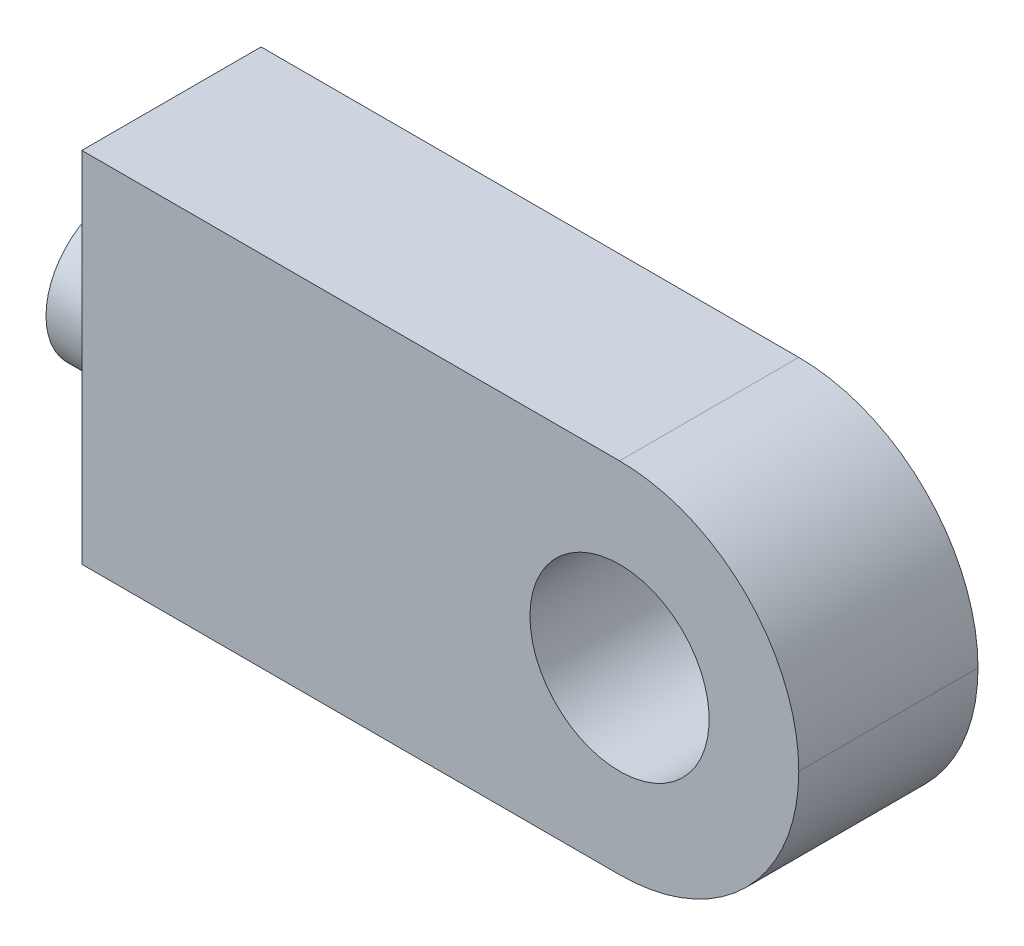
ISO-10303-21;
HEADER;
FILE_DESCRIPTION(('STEP AP214'),'2;1');
FILE_NAME('part.step','',(''),(''),'','','');
FILE_SCHEMA(('AUTOMOTIVE_DESIGN { 1 0 10303 214 1 1 1 1 }'));
ENDSEC;
DATA;
#1=APPLICATION_CONTEXT('core data for automotive mechanical design processes');
#2=APPLICATION_PROTOCOL_DEFINITION('international standard','automotive_design',2000,#1);
#3=PRODUCT_CONTEXT('',#1,'mechanical');
#4=PRODUCT('Part','Part','',(#3));
#5=PRODUCT_RELATED_PRODUCT_CATEGORY('part','',(#4));
#6=PRODUCT_DEFINITION_FORMATION('','',#4);
#7=PRODUCT_DEFINITION_CONTEXT('part definition',#1,'design');
#8=PRODUCT_DEFINITION('design','',#6,#7);
#9=PRODUCT_DEFINITION_SHAPE('','',#8);
#10=(LENGTH_UNIT() NAMED_UNIT(*) SI_UNIT(.MILLI.,.METRE.));
#11=(NAMED_UNIT(*) PLANE_ANGLE_UNIT() SI_UNIT($,.RADIAN.));
#12=(NAMED_UNIT(*) SI_UNIT($,.STERADIAN.) SOLID_ANGLE_UNIT());
#13=UNCERTAINTY_MEASURE_WITH_UNIT(LENGTH_MEASURE(1.E-05),#10,'distance_accuracy_value','');
#14=(GEOMETRIC_REPRESENTATION_CONTEXT(3) GLOBAL_UNCERTAINTY_ASSIGNED_CONTEXT((#13)) GLOBAL_UNIT_ASSIGNED_CONTEXT((#10,
#11,#12)) REPRESENTATION_CONTEXT('',''));
#15=CARTESIAN_POINT('',(0.,0.,0.));
#16=DIRECTION('',(0.,0.,1.));
#17=DIRECTION('',(1.,0.,0.));
#18=AXIS2_PLACEMENT_3D('',#15,#16,#17);
#19=CARTESIAN_POINT('',(-40.,-20.,10.));
#20=DIRECTION('',(-1.,0.,0.));
#21=DIRECTION('',(0.,0.,1.));
#22=AXIS2_PLACEMENT_3D('',#19,#20,#21);
#23=PLANE('',#22);
#24=CARTESIAN_POINT('',(-40.,0.,0.));
#25=DIRECTION('',(-1.,0.,0.));
#26=DIRECTION('',(0.,0.,1.));
#27=AXIS2_PLACEMENT_3D('',#24,#25,#26);
#28=CIRCLE('',#27,8.);
#29=CARTESIAN_POINT('',(-40.,0.,8.));
#30=VERTEX_POINT('',#29);
#31=EDGE_CURVE('E11',#30,#30,#28,.T.);
#32=ORIENTED_EDGE('',*,*,#31,.F.);
#33=EDGE_LOOP('',(#32));
#34=FACE_BOUND('',#33,.T.);
#35=DIRECTION('',(0.,1.,0.));
#36=VECTOR('',#35,1.);
#37=CARTESIAN_POINT('',(-40.,-20.,-10.));
#38=LINE('',#37,#36);
#39=CARTESIAN_POINT('',(-40.,-20.,-10.));
#40=VERTEX_POINT('',#39);
#41=CARTESIAN_POINT('',(-40.,20.,-10.));
#42=VERTEX_POINT('',#41);
#43=EDGE_CURVE('E113',#40,#42,#38,.T.);
#44=ORIENTED_EDGE('',*,*,#43,.F.);
#45=DIRECTION('',(0.,0.,-1.));
#46=VECTOR('',#45,1.);
#47=CARTESIAN_POINT('',(-40.,-20.,10.));
#48=LINE('',#47,#46);
#49=CARTESIAN_POINT('',(-40.,-20.,10.));
#50=VERTEX_POINT('',#49);
#51=EDGE_CURVE('E96',#50,#40,#48,.T.);
#52=ORIENTED_EDGE('',*,*,#51,.F.);
#53=DIRECTION('',(0.,1.,0.));
#54=VECTOR('',#53,1.);
#55=CARTESIAN_POINT('',(-40.,-20.,10.));
#56=LINE('',#55,#54);
#57=CARTESIAN_POINT('',(-40.,20.,10.));
#58=VERTEX_POINT('',#57);
#59=EDGE_CURVE('E101',#50,#58,#56,.T.);
#60=ORIENTED_EDGE('',*,*,#59,.T.);
#61=DIRECTION('',(0.,0.,-1.));
#62=VECTOR('',#61,1.);
#63=CARTESIAN_POINT('',(-40.,20.,10.));
#64=LINE('',#63,#62);
#65=EDGE_CURVE('E86',#58,#42,#64,.T.);
#66=ORIENTED_EDGE('',*,*,#65,.T.);
#67=EDGE_LOOP('',(#44,#52,#60,#66));
#68=FACE_BOUND('',#67,.T.);
#69=ADVANCED_FACE('F39',(#34,#68),#23,.T.);
#70=CARTESIAN_POINT('',(-40.,-20.,10.));
#71=DIRECTION('',(0.,1.,0.));
#72=DIRECTION('',(0.,0.,1.));
#73=AXIS2_PLACEMENT_3D('',#70,#71,#72);
#74=PLANE('',#73);
#75=DIRECTION('',(1.,0.,0.));
#76=VECTOR('',#75,1.);
#77=CARTESIAN_POINT('',(-40.,-20.,-10.));
#78=LINE('',#77,#76);
#79=CARTESIAN_POINT('',(20.,-20.,-10.));
#80=VERTEX_POINT('',#79);
#81=EDGE_CURVE('E104',#40,#80,#78,.T.);
#82=ORIENTED_EDGE('',*,*,#81,.T.);
#83=DIRECTION('',(0.,0.,-1.));
#84=VECTOR('',#83,1.);
#85=CARTESIAN_POINT('',(20.,-20.,10.));
#86=LINE('',#85,#84);
#87=CARTESIAN_POINT('',(20.,-20.,10.));
#88=VERTEX_POINT('',#87);
#89=EDGE_CURVE('E121',#80,#88,#86,.F.);
#90=ORIENTED_EDGE('',*,*,#89,.T.);
#91=DIRECTION('',(1.,0.,0.));
#92=VECTOR('',#91,1.);
#93=CARTESIAN_POINT('',(-40.,-20.,10.));
#94=LINE('',#93,#92);
#95=EDGE_CURVE('E97',#50,#88,#94,.T.);
#96=ORIENTED_EDGE('',*,*,#95,.F.);
#97=ORIENTED_EDGE('',*,*,#51,.T.);
#98=EDGE_LOOP('',(#82,#90,#96,#97));
#99=FACE_BOUND('',#98,.T.);
#100=ADVANCED_FACE('F137',(#99),#74,.F.);
#101=CARTESIAN_POINT('',(-40.,20.,10.));
#102=DIRECTION('',(0.,1.,0.));
#103=DIRECTION('',(0.,0.,1.));
#104=AXIS2_PLACEMENT_3D('',#101,#102,#103);
#105=PLANE('',#104);
#106=DIRECTION('',(1.,0.,0.));
#107=VECTOR('',#106,1.);
#108=CARTESIAN_POINT('',(-40.,20.,10.));
#109=LINE('',#108,#107);
#110=CARTESIAN_POINT('',(20.,20.,10.));
#111=VERTEX_POINT('',#110);
#112=EDGE_CURVE('E88',#58,#111,#109,.T.);
#113=ORIENTED_EDGE('',*,*,#112,.T.);
#114=DIRECTION('',(0.,0.,-1.));
#115=VECTOR('',#114,1.);
#116=CARTESIAN_POINT('',(20.,20.,-10.));
#117=LINE('',#116,#115);
#118=CARTESIAN_POINT('',(20.,20.,-10.));
#119=VERTEX_POINT('',#118);
#120=EDGE_CURVE('E48',#111,#119,#117,.T.);
#121=ORIENTED_EDGE('',*,*,#120,.T.);
#122=DIRECTION('',(1.,0.,0.));
#123=VECTOR('',#122,1.);
#124=CARTESIAN_POINT('',(-40.,20.,-10.));
#125=LINE('',#124,#123);
#126=EDGE_CURVE('E91',#42,#119,#125,.T.);
#127=ORIENTED_EDGE('',*,*,#126,.F.);
#128=ORIENTED_EDGE('',*,*,#65,.F.);
#129=EDGE_LOOP('',(#113,#121,#127,#128));
#130=FACE_BOUND('',#129,.T.);
#131=ADVANCED_FACE('F87',(#130),#105,.T.);
#132=CARTESIAN_POINT('',(0.,0.,10.));
#133=DIRECTION('',(0.,0.,-1.));
#134=DIRECTION('',(-1.,0.,0.));
#135=AXIS2_PLACEMENT_3D('',#132,#133,#134);
#136=PLANE('',#135);
#137=CARTESIAN_POINT('',(20.,0.,10.));
#138=DIRECTION('',(0.,0.,-1.));
#139=DIRECTION('',(-1.,0.,0.));
#140=AXIS2_PLACEMENT_3D('',#137,#138,#139);
#141=CIRCLE('',#140,10.);
#142=CARTESIAN_POINT('',(10.,0.,10.));
#143=VERTEX_POINT('',#142);
#144=EDGE_CURVE('E109',#143,#143,#141,.F.);
#145=ORIENTED_EDGE('',*,*,#144,.F.);
#146=EDGE_LOOP('',(#145));
#147=FACE_BOUND('',#146,.T.);
#148=ORIENTED_EDGE('',*,*,#95,.T.);
#149=CARTESIAN_POINT('',(20.,0.,10.));
#150=DIRECTION('',(0.,0.,-1.));
#151=DIRECTION('',(-1.,0.,0.));
#152=AXIS2_PLACEMENT_3D('',#149,#150,#151);
#153=CIRCLE('',#152,20.);
#154=CARTESIAN_POINT('',(40.,0.,10.));
#155=VERTEX_POINT('',#154);
#156=EDGE_CURVE('E61',#88,#155,#153,.F.);
#157=ORIENTED_EDGE('',*,*,#156,.T.);
#158=CARTESIAN_POINT('',(20.,0.,10.));
#159=DIRECTION('',(0.,0.,-1.));
#160=DIRECTION('',(-1.,0.,0.));
#161=AXIS2_PLACEMENT_3D('',#158,#159,#160);
#162=CIRCLE('',#161,20.);
#163=EDGE_CURVE('E56',#155,#111,#162,.F.);
#164=ORIENTED_EDGE('',*,*,#163,.T.);
#165=ORIENTED_EDGE('',*,*,#112,.F.);
#166=ORIENTED_EDGE('',*,*,#59,.F.);
#167=EDGE_LOOP('',(#148,#157,#164,#165,#166));
#168=FACE_BOUND('',#167,.T.);
#169=ADVANCED_FACE('F100',(#147,#168),#136,.F.);
#170=CARTESIAN_POINT('',(0.,0.,-10.));
#171=DIRECTION('',(0.,0.,-1.));
#172=DIRECTION('',(-1.,0.,0.));
#173=AXIS2_PLACEMENT_3D('',#170,#171,#172);
#174=PLANE('',#173);
#175=CARTESIAN_POINT('',(20.,0.,-10.));
#176=DIRECTION('',(0.,0.,-1.));
#177=DIRECTION('',(-1.,0.,0.));
#178=AXIS2_PLACEMENT_3D('',#175,#176,#177);
#179=CIRCLE('',#178,10.);
#180=CARTESIAN_POINT('',(10.,0.,-10.));
#181=VERTEX_POINT('',#180);
#182=EDGE_CURVE('E169',#181,#181,#179,.T.);
#183=ORIENTED_EDGE('',*,*,#182,.F.);
#184=EDGE_LOOP('',(#183));
#185=FACE_BOUND('',#184,.T.);
#186=CARTESIAN_POINT('',(20.,0.,-10.));
#187=DIRECTION('',(0.,0.,-1.));
#188=DIRECTION('',(-1.,0.,0.));
#189=AXIS2_PLACEMENT_3D('',#186,#187,#188);
#190=CIRCLE('',#189,20.);
#191=CARTESIAN_POINT('',(40.,0.,-10.));
#192=VERTEX_POINT('',#191);
#193=EDGE_CURVE('E116',#119,#192,#190,.T.);
#194=ORIENTED_EDGE('',*,*,#193,.T.);
#195=CARTESIAN_POINT('',(20.,0.,-10.));
#196=DIRECTION('',(0.,0.,-1.));
#197=DIRECTION('',(-1.,0.,0.));
#198=AXIS2_PLACEMENT_3D('',#195,#196,#197);
#199=CIRCLE('',#198,20.);
#200=EDGE_CURVE('E119',#192,#80,#199,.T.);
#201=ORIENTED_EDGE('',*,*,#200,.T.);
#202=ORIENTED_EDGE('',*,*,#81,.F.);
#203=ORIENTED_EDGE('',*,*,#43,.T.);
#204=ORIENTED_EDGE('',*,*,#126,.T.);
#205=EDGE_LOOP('',(#194,#201,#202,#203,#204));
#206=FACE_BOUND('',#205,.T.);
#207=ADVANCED_FACE('F128',(#185,#206),#174,.T.);
#208=CARTESIAN_POINT('',(20.,0.,10.));
#209=DIRECTION('',(0.,0.,1.));
#210=DIRECTION('',(1.,0.,0.));
#211=AXIS2_PLACEMENT_3D('',#208,#209,#210);
#212=CYLINDRICAL_SURFACE('',#211,20.);
#213=ORIENTED_EDGE('',*,*,#120,.F.);
#214=ORIENTED_EDGE('',*,*,#163,.F.);
#215=DIRECTION('',(0.,0.,-1.));
#216=VECTOR('',#215,1.);
#217=CARTESIAN_POINT('',(40.,0.,10.));
#218=LINE('',#217,#216);
#219=EDGE_CURVE('E43',#192,#155,#218,.F.);
#220=ORIENTED_EDGE('',*,*,#219,.F.);
#221=ORIENTED_EDGE('',*,*,#193,.F.);
#222=EDGE_LOOP('',(#213,#214,#220,#221));
#223=FACE_BOUND('',#222,.T.);
#224=ADVANCED_FACE('F41',(#223),#212,.T.);
#225=CARTESIAN_POINT('',(20.,0.,10.));
#226=DIRECTION('',(0.,0.,-1.));
#227=DIRECTION('',(-1.,0.,0.));
#228=AXIS2_PLACEMENT_3D('',#225,#226,#227);
#229=CYLINDRICAL_SURFACE('',#228,20.);
#230=ORIENTED_EDGE('',*,*,#156,.F.);
#231=ORIENTED_EDGE('',*,*,#89,.F.);
#232=ORIENTED_EDGE('',*,*,#200,.F.);
#233=ORIENTED_EDGE('',*,*,#219,.T.);
#234=EDGE_LOOP('',(#230,#231,#232,#233));
#235=FACE_BOUND('',#234,.T.);
#236=ADVANCED_FACE('F135',(#235),#229,.T.);
#237=CARTESIAN_POINT('',(20.,0.,10.001));
#238=DIRECTION('',(0.,0.,-1.));
#239=DIRECTION('',(-1.,0.,0.));
#240=AXIS2_PLACEMENT_3D('',#237,#238,#239);
#241=CYLINDRICAL_SURFACE('',#240,10.);
#242=ORIENTED_EDGE('',*,*,#182,.T.);
#243=EDGE_LOOP('',(#242));
#244=FACE_BOUND('',#243,.T.);
#245=ORIENTED_EDGE('',*,*,#144,.T.);
#246=EDGE_LOOP('',(#245));
#247=FACE_BOUND('',#246,.T.);
#248=ADVANCED_FACE('F151',(#244,#247),#241,.F.);
#249=CARTESIAN_POINT('',(-46.,0.,0.));
#250=DIRECTION('',(1.,0.,0.));
#251=DIRECTION('',(0.,0.,-1.));
#252=AXIS2_PLACEMENT_3D('',#249,#250,#251);
#253=CYLINDRICAL_SURFACE('',#252,8.);
#254=CARTESIAN_POINT('',(-46.,0.,0.));
#255=DIRECTION('',(-1.,0.,0.));
#256=DIRECTION('',(0.,0.,1.));
#257=AXIS2_PLACEMENT_3D('',#254,#255,#256);
#258=CIRCLE('',#257,8.);
#259=CARTESIAN_POINT('',(-46.,0.,8.));
#260=VERTEX_POINT('',#259);
#261=EDGE_CURVE('E170',#260,#260,#258,.T.);
#262=ORIENTED_EDGE('',*,*,#261,.F.);
#263=EDGE_LOOP('',(#262));
#264=FACE_BOUND('',#263,.T.);
#265=ORIENTED_EDGE('',*,*,#31,.T.);
#266=EDGE_LOOP('',(#265));
#267=FACE_BOUND('',#266,.T.);
#268=ADVANCED_FACE('F156',(#264,#267),#253,.T.);
#269=CARTESIAN_POINT('',(-46.,0.,0.));
#270=DIRECTION('',(-1.,0.,0.));
#271=DIRECTION('',(0.,0.,1.));
#272=AXIS2_PLACEMENT_3D('',#269,#270,#271);
#273=PLANE('',#272);
#274=ORIENTED_EDGE('',*,*,#261,.T.);
#275=EDGE_LOOP('',(#274));
#276=FACE_BOUND('',#275,.T.);
#277=ADVANCED_FACE('F176',(#276),#273,.T.);
#278=CLOSED_SHELL('',(#69,#100,#131,#169,#207,#224,#236,#248,#268,#277));
#279=MANIFOLD_SOLID_BREP('B2',#278);
#280=ADVANCED_BREP_SHAPE_REPRESENTATION('',(#18,#279),#14);
#281=SHAPE_DEFINITION_REPRESENTATION(#9,#280);
ENDSEC;
END-ISO-10303-21;
